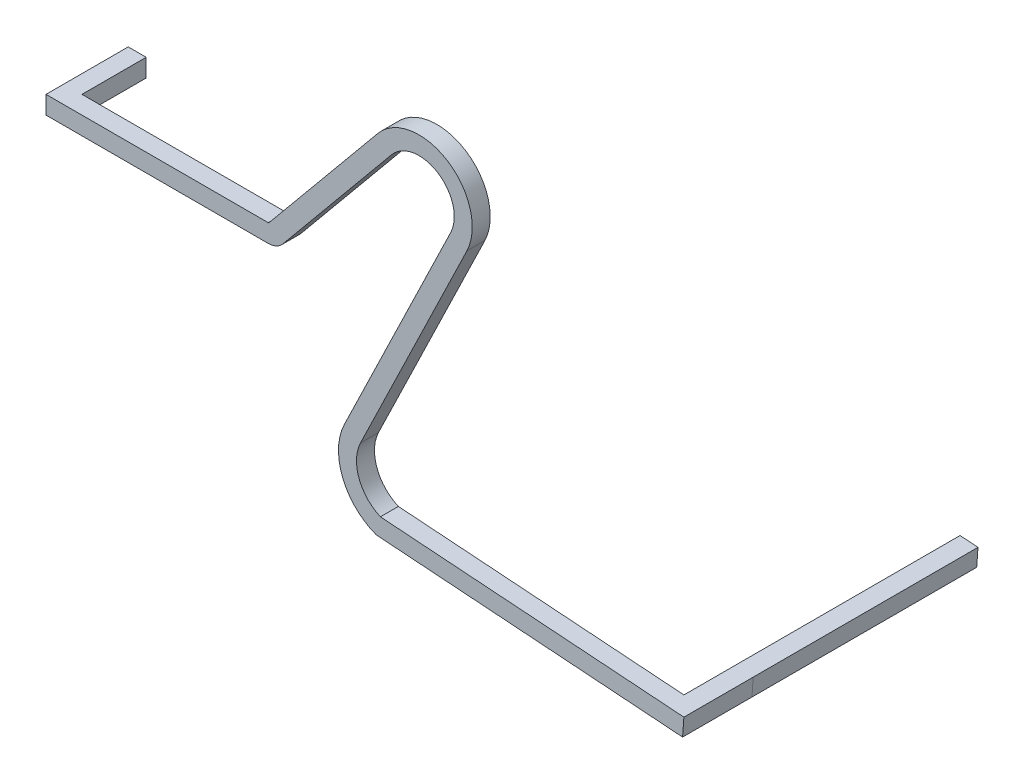
ISO-10303-21;
HEADER;
FILE_DESCRIPTION(('STEP AP214'),'2;1');
FILE_NAME('part.step','',(''),(''),'','','');
FILE_SCHEMA(('AUTOMOTIVE_DESIGN { 1 0 10303 214 1 1 1 1 }'));
ENDSEC;
DATA;
#1=APPLICATION_CONTEXT('core data for automotive mechanical design processes');
#2=APPLICATION_PROTOCOL_DEFINITION('international standard','automotive_design',2000,#1);
#3=PRODUCT_CONTEXT('',#1,'mechanical');
#4=PRODUCT('Part','Part','',(#3));
#5=PRODUCT_RELATED_PRODUCT_CATEGORY('part','',(#4));
#6=PRODUCT_DEFINITION_FORMATION('','',#4);
#7=PRODUCT_DEFINITION_CONTEXT('part definition',#1,'design');
#8=PRODUCT_DEFINITION('design','',#6,#7);
#9=PRODUCT_DEFINITION_SHAPE('','',#8);
#10=(LENGTH_UNIT() NAMED_UNIT(*) SI_UNIT(.MILLI.,.METRE.));
#11=(NAMED_UNIT(*) PLANE_ANGLE_UNIT() SI_UNIT($,.RADIAN.));
#12=(NAMED_UNIT(*) SI_UNIT($,.STERADIAN.) SOLID_ANGLE_UNIT());
#13=UNCERTAINTY_MEASURE_WITH_UNIT(LENGTH_MEASURE(1.E-05),#10,'distance_accuracy_value','');
#14=(GEOMETRIC_REPRESENTATION_CONTEXT(3) GLOBAL_UNCERTAINTY_ASSIGNED_CONTEXT((#13)) GLOBAL_UNIT_ASSIGNED_CONTEXT((#10,
#11,#12)) REPRESENTATION_CONTEXT('',''));
#15=CARTESIAN_POINT('',(0.,0.,0.));
#16=DIRECTION('',(0.,0.,1.));
#17=DIRECTION('',(1.,0.,0.));
#18=AXIS2_PLACEMENT_3D('',#15,#16,#17);
#19=CARTESIAN_POINT('',(34.5870726712376,3.,0.));
#20=DIRECTION('',(0.,0.,1.));
#21=DIRECTION('',(1.,0.,0.));
#22=AXIS2_PLACEMENT_3D('',#19,#20,#21);
#23=PLANE('',#22);
#24=DIRECTION('',(0.0715229264478328,0.997438956023043,0.));
#25=VECTOR('',#24,1.);
#26=CARTESIAN_POINT('',(96.5350253753501,-31.3225304509611,0.));
#27=LINE('',#26,#25);
#28=CARTESIAN_POINT('',(96.3347611812961,-34.1153595278256,0.));
#29=VERTEX_POINT('',#28);
#30=CARTESIAN_POINT('',(96.5350253753504,-31.3225304509611,0.));
#31=VERTEX_POINT('',#30);
#32=EDGE_CURVE('E222',#29,#31,#27,.T.);
#33=ORIENTED_EDGE('',*,*,#32,.F.);
#34=DIRECTION('',(0.997438956023042,-0.0715229264478418,0.));
#35=VECTOR('',#34,1.);
#36=CARTESIAN_POINT('',(51.4340056346123,-30.8956803514451,0.));
#37=LINE('',#36,#35);
#38=CARTESIAN_POINT('',(51.4340056346123,-30.8956803514452,0.));
#39=VERTEX_POINT('',#38);
#40=EDGE_CURVE('E425',#39,#29,#37,.T.);
#41=ORIENTED_EDGE('',*,*,#40,.F.);
#42=CARTESIAN_POINT('',(54.5578663478825,-22.4414513150105,0.));
#43=DIRECTION('',(0.,0.,1.));
#44=DIRECTION('',(1.,0.,0.));
#45=AXIS2_PLACEMENT_3D('',#42,#43,#44);
#46=CIRCLE('',#45,9.01290709795725);
#47=CARTESIAN_POINT('',(46.4475543876039,-18.5101240247217,0.));
#48=VERTEX_POINT('',#47);
#49=EDGE_CURVE('E423',#48,#39,#46,.T.);
#50=ORIENTED_EDGE('',*,*,#49,.F.);
#51=DIRECTION('',(-0.436188595706244,-0.899855271127427,0.));
#52=VECTOR('',#51,1.);
#53=CARTESIAN_POINT('',(63.0227210244412,15.6843762781205,0.));
#54=LINE('',#53,#52);
#55=CARTESIAN_POINT('',(63.0227210244412,15.6843762781205,0.));
#56=VERTEX_POINT('',#55);
#57=EDGE_CURVE('E421',#56,#48,#54,.T.);
#58=ORIENTED_EDGE('',*,*,#57,.F.);
#59=CARTESIAN_POINT('',(58.0735170332403,18.0834135545048,0.));
#60=DIRECTION('',(0.,0.,-1.));
#61=DIRECTION('',(1.,0.,0.));
#62=AXIS2_PLACEMENT_3D('',#59,#60,#61);
#63=CIRCLE('',#62,5.49999999999999);
#64=CARTESIAN_POINT('',(53.8333333333333,21.586389744981,0.));
#65=VERTEX_POINT('',#64);
#66=EDGE_CURVE('E419',#65,#56,#63,.T.);
#67=ORIENTED_EDGE('',*,*,#66,.F.);
#68=DIRECTION('',(0.636904761904762,0.770942490892179,0.));
#69=VECTOR('',#68,1.);
#70=CARTESIAN_POINT('',(36.8999001439141,1.08928571428572,0.));
#71=LINE('',#70,#69);
#72=CARTESIAN_POINT('',(36.8999001439141,1.08928571428571,0.));
#73=VERTEX_POINT('',#72);
#74=EDGE_CURVE('E417',#73,#65,#71,.T.);
#75=ORIENTED_EDGE('',*,*,#74,.F.);
#76=CARTESIAN_POINT('',(34.5870726712376,3.,0.));
#77=DIRECTION('',(0.,0.,1.));
#78=DIRECTION('',(1.,0.,0.));
#79=AXIS2_PLACEMENT_3D('',#76,#77,#78);
#80=CIRCLE('',#79,3.);
#81=CARTESIAN_POINT('',(34.5870726712376,0.,0.));
#82=VERTEX_POINT('',#81);
#83=EDGE_CURVE('E415',#82,#73,#80,.T.);
#84=ORIENTED_EDGE('',*,*,#83,.F.);
#85=DIRECTION('',(1.,0.,0.));
#86=VECTOR('',#85,1.);
#87=CARTESIAN_POINT('',(0.,0.,0.));
#88=LINE('',#87,#86);
#89=CARTESIAN_POINT('',(2.8,0.,0.));
#90=VERTEX_POINT('',#89);
#91=EDGE_CURVE('E238',#90,#82,#88,.T.);
#92=ORIENTED_EDGE('',*,*,#91,.F.);
#93=DIRECTION('',(0.,-1.,0.));
#94=VECTOR('',#93,1.);
#95=CARTESIAN_POINT('',(2.8,2.8,0.));
#96=LINE('',#95,#94);
#97=CARTESIAN_POINT('',(2.8,2.8,0.));
#98=VERTEX_POINT('',#97);
#99=EDGE_CURVE('E228',#98,#90,#96,.T.);
#100=ORIENTED_EDGE('',*,*,#99,.F.);
#101=DIRECTION('',(-1.,0.,0.));
#102=VECTOR('',#101,1.);
#103=CARTESIAN_POINT('',(0.,2.8,0.));
#104=LINE('',#103,#102);
#105=CARTESIAN_POINT('',(34.5870726712376,2.8,0.));
#106=VERTEX_POINT('',#105);
#107=EDGE_CURVE('E364',#106,#98,#104,.T.);
#108=ORIENTED_EDGE('',*,*,#107,.F.);
#109=CARTESIAN_POINT('',(34.5870726712376,3.,0.));
#110=DIRECTION('',(0.,0.,-1.));
#111=DIRECTION('',(1.,0.,0.));
#112=AXIS2_PLACEMENT_3D('',#109,#110,#111);
#113=CIRCLE('',#112,0.199999999999999);
#114=CARTESIAN_POINT('',(34.741261169416,2.87261904761905,0.));
#115=VERTEX_POINT('',#114);
#116=EDGE_CURVE('E362',#115,#106,#113,.T.);
#117=ORIENTED_EDGE('',*,*,#116,.F.);
#118=DIRECTION('',(-0.636904761904762,-0.77094249089218,0.));
#119=VECTOR('',#118,1.);
#120=CARTESIAN_POINT('',(34.741261169416,2.87261904761905,0.));
#121=LINE('',#120,#119);
#122=CARTESIAN_POINT('',(51.6746943588352,23.3697230783144,0.));
#123=VERTEX_POINT('',#122);
#124=EDGE_CURVE('E357',#123,#115,#121,.T.);
#125=ORIENTED_EDGE('',*,*,#124,.F.);
#126=CARTESIAN_POINT('',(58.0735170332403,18.0834135545048,0.));
#127=DIRECTION('',(0.,0.,1.));
#128=DIRECTION('',(1.,0.,0.));
#129=AXIS2_PLACEMENT_3D('',#126,#127,#128);
#130=CIRCLE('',#129,8.29999999999999);
#131=CARTESIAN_POINT('',(65.542315783598,14.463048210143,0.));
#132=VERTEX_POINT('',#131);
#133=EDGE_CURVE('E355',#132,#123,#130,.T.);
#134=ORIENTED_EDGE('',*,*,#133,.F.);
#135=DIRECTION('',(0.436188595706244,0.899855271127427,0.));
#136=VECTOR('',#135,1.);
#137=CARTESIAN_POINT('',(65.542315783598,14.463048210143,0.));
#138=LINE('',#137,#136);
#139=CARTESIAN_POINT('',(48.9671491467607,-19.7314520926992,0.));
#140=VERTEX_POINT('',#139);
#141=EDGE_CURVE('E345',#140,#132,#138,.T.);
#142=ORIENTED_EDGE('',*,*,#141,.F.);
#143=CARTESIAN_POINT('',(54.5578663478825,-22.4414513150105,0.));
#144=DIRECTION('',(0.,0.,-1.));
#145=DIRECTION('',(1.,0.,0.));
#146=AXIS2_PLACEMENT_3D('',#143,#144,#145);
#147=CIRCLE('',#146,6.21290709795726);
#148=CARTESIAN_POINT('',(52.0689106312986,-28.1340178757748,0.));
#149=VERTEX_POINT('',#148);
#150=EDGE_CURVE('E336',#149,#140,#147,.T.);
#151=ORIENTED_EDGE('',*,*,#150,.F.);
#152=DIRECTION('',(-0.997438956023042,0.0715229264478419,0.));
#153=VECTOR('',#152,1.);
#154=CARTESIAN_POINT('',(52.0689106312986,-28.1340178757748,0.));
#155=LINE('',#154,#153);
#156=EDGE_CURVE('E346',#31,#149,#155,.T.);
#157=ORIENTED_EDGE('',*,*,#156,.F.);
#158=EDGE_LOOP('',(#33,#41,#50,#58,#67,#75,#84,#92,#100,#108,#117,#125,#134,#142,#151,#157));
#159=FACE_BOUND('',#158,.T.);
#160=ADVANCED_FACE('F33',(#159),#23,.F.);
#161=CARTESIAN_POINT('',(0.,2.8,2.8));
#162=DIRECTION('',(1.,0.,0.));
#163=DIRECTION('',(0.,0.,-1.));
#164=AXIS2_PLACEMENT_3D('',#161,#162,#163);
#165=PLANE('',#164);
#166=DIRECTION('',(0.,0.,-1.));
#167=VECTOR('',#166,1.);
#168=CARTESIAN_POINT('',(0.,2.8,2.8));
#169=LINE('',#168,#167);
#170=CARTESIAN_POINT('',(0.,2.8,2.8));
#171=VERTEX_POINT('',#170);
#172=CARTESIAN_POINT('',(0.,2.8,-9.99999999999999));
#173=VERTEX_POINT('',#172);
#174=EDGE_CURVE('E367',#171,#173,#169,.T.);
#175=ORIENTED_EDGE('',*,*,#174,.T.);
#176=DIRECTION('',(0.,1.,0.));
#177=VECTOR('',#176,1.);
#178=CARTESIAN_POINT('',(0.,2.8,-9.99999999999999));
#179=LINE('',#178,#177);
#180=CARTESIAN_POINT('',(0.,0.,-9.99999999999999));
#181=VERTEX_POINT('',#180);
#182=EDGE_CURVE('E202',#181,#173,#179,.T.);
#183=ORIENTED_EDGE('',*,*,#182,.F.);
#184=DIRECTION('',(0.,0.,-1.));
#185=VECTOR('',#184,1.);
#186=CARTESIAN_POINT('',(0.,0.,2.8));
#187=LINE('',#186,#185);
#188=CARTESIAN_POINT('',(0.,0.,2.8));
#189=VERTEX_POINT('',#188);
#190=EDGE_CURVE('E11',#189,#181,#187,.T.);
#191=ORIENTED_EDGE('',*,*,#190,.F.);
#192=DIRECTION('',(0.,-1.,0.));
#193=VECTOR('',#192,1.);
#194=CARTESIAN_POINT('',(0.,2.8,2.8));
#195=LINE('',#194,#193);
#196=EDGE_CURVE('E231',#171,#189,#195,.T.);
#197=ORIENTED_EDGE('',*,*,#196,.F.);
#198=EDGE_LOOP('',(#175,#183,#191,#197));
#199=FACE_BOUND('',#198,.T.);
#200=ADVANCED_FACE('F35',(#199),#165,.F.);
#201=CARTESIAN_POINT('',(0.,0.,2.8));
#202=DIRECTION('',(0.,1.,0.));
#203=DIRECTION('',(0.,0.,1.));
#204=AXIS2_PLACEMENT_3D('',#201,#202,#203);
#205=PLANE('',#204);
#206=ORIENTED_EDGE('',*,*,#190,.T.);
#207=DIRECTION('',(1.,0.,0.));
#208=VECTOR('',#207,1.);
#209=CARTESIAN_POINT('',(0.,0.,-9.99999999999999));
#210=LINE('',#209,#208);
#211=CARTESIAN_POINT('',(2.8,0.,-9.99999999999999));
#212=VERTEX_POINT('',#211);
#213=EDGE_CURVE('E219',#181,#212,#210,.T.);
#214=ORIENTED_EDGE('',*,*,#213,.T.);
#215=DIRECTION('',(0.,0.,1.));
#216=VECTOR('',#215,1.);
#217=CARTESIAN_POINT('',(2.8,0.,-45.));
#218=LINE('',#217,#216);
#219=EDGE_CURVE('E237',#212,#90,#218,.T.);
#220=ORIENTED_EDGE('',*,*,#219,.T.);
#221=ORIENTED_EDGE('',*,*,#91,.T.);
#222=DIRECTION('',(0.,0.,-1.));
#223=VECTOR('',#222,1.);
#224=CARTESIAN_POINT('',(34.5870726712376,0.,2.8));
#225=LINE('',#224,#223);
#226=CARTESIAN_POINT('',(34.5870726712376,0.,2.8));
#227=VERTEX_POINT('',#226);
#228=EDGE_CURVE('E42',#227,#82,#225,.T.);
#229=ORIENTED_EDGE('',*,*,#228,.F.);
#230=DIRECTION('',(1.,0.,0.));
#231=VECTOR('',#230,1.);
#232=CARTESIAN_POINT('',(0.,0.,2.8));
#233=LINE('',#232,#231);
#234=EDGE_CURVE('E455',#189,#227,#233,.T.);
#235=ORIENTED_EDGE('',*,*,#234,.F.);
#236=EDGE_LOOP('',(#206,#214,#220,#221,#229,#235));
#237=FACE_BOUND('',#236,.T.);
#238=ADVANCED_FACE('F288',(#237),#205,.F.);
#239=CARTESIAN_POINT('',(34.5870726712376,3.,2.8));
#240=DIRECTION('',(0.,0.,-1.));
#241=DIRECTION('',(-1.,0.,0.));
#242=AXIS2_PLACEMENT_3D('',#239,#240,#241);
#243=CYLINDRICAL_SURFACE('',#242,3.);
#244=ORIENTED_EDGE('',*,*,#83,.T.);
#245=DIRECTION('',(0.,0.,-1.));
#246=VECTOR('',#245,1.);
#247=CARTESIAN_POINT('',(36.8999001439141,1.08928571428571,2.8));
#248=LINE('',#247,#246);
#249=CARTESIAN_POINT('',(36.8999001439141,1.08928571428571,2.8));
#250=VERTEX_POINT('',#249);
#251=EDGE_CURVE('E373',#250,#73,#248,.T.);
#252=ORIENTED_EDGE('',*,*,#251,.F.);
#253=CARTESIAN_POINT('',(34.5870726712376,3.,2.8));
#254=DIRECTION('',(0.,0.,1.));
#255=DIRECTION('',(1.,0.,0.));
#256=AXIS2_PLACEMENT_3D('',#253,#254,#255);
#257=CIRCLE('',#256,3.);
#258=EDGE_CURVE('E454',#227,#250,#257,.T.);
#259=ORIENTED_EDGE('',*,*,#258,.F.);
#260=ORIENTED_EDGE('',*,*,#228,.T.);
#261=EDGE_LOOP('',(#244,#252,#259,#260));
#262=FACE_BOUND('',#261,.T.);
#263=ADVANCED_FACE('F285',(#262),#243,.T.);
#264=CARTESIAN_POINT('',(36.8999001439141,1.08928571428572,2.8));
#265=DIRECTION('',(-0.770942490892179,0.636904761904762,0.));
#266=DIRECTION('',(-0.636904761904762,-0.770942490892179,0.));
#267=AXIS2_PLACEMENT_3D('',#264,#265,#266);
#268=PLANE('',#267);
#269=ORIENTED_EDGE('',*,*,#74,.T.);
#270=DIRECTION('',(0.,0.,-1.));
#271=VECTOR('',#270,1.);
#272=CARTESIAN_POINT('',(53.8333333333333,21.586389744981,2.8));
#273=LINE('',#272,#271);
#274=CARTESIAN_POINT('',(53.8333333333333,21.586389744981,2.8));
#275=VERTEX_POINT('',#274);
#276=EDGE_CURVE('E376',#275,#65,#273,.T.);
#277=ORIENTED_EDGE('',*,*,#276,.F.);
#278=DIRECTION('',(0.636904761904762,0.770942490892179,0.));
#279=VECTOR('',#278,1.);
#280=CARTESIAN_POINT('',(36.8999001439141,1.08928571428572,2.8));
#281=LINE('',#280,#279);
#282=EDGE_CURVE('E447',#250,#275,#281,.T.);
#283=ORIENTED_EDGE('',*,*,#282,.F.);
#284=ORIENTED_EDGE('',*,*,#251,.T.);
#285=EDGE_LOOP('',(#269,#277,#283,#284));
#286=FACE_BOUND('',#285,.T.);
#287=ADVANCED_FACE('F281',(#286),#268,.F.);
#288=CARTESIAN_POINT('',(58.0735170332403,18.0834135545048,2.8));
#289=DIRECTION('',(0.,0.,-1.));
#290=DIRECTION('',(-1.,0.,0.));
#291=AXIS2_PLACEMENT_3D('',#288,#289,#290);
#292=CYLINDRICAL_SURFACE('',#291,5.49999999999999);
#293=ORIENTED_EDGE('',*,*,#66,.T.);
#294=DIRECTION('',(0.,0.,-1.));
#295=VECTOR('',#294,1.);
#296=CARTESIAN_POINT('',(63.0227210244412,15.6843762781205,2.8));
#297=LINE('',#296,#295);
#298=CARTESIAN_POINT('',(63.0227210244412,15.6843762781205,2.8));
#299=VERTEX_POINT('',#298);
#300=EDGE_CURVE('E379',#299,#56,#297,.T.);
#301=ORIENTED_EDGE('',*,*,#300,.F.);
#302=CARTESIAN_POINT('',(58.0735170332403,18.0834135545048,2.8));
#303=DIRECTION('',(0.,0.,-1.));
#304=DIRECTION('',(1.,0.,0.));
#305=AXIS2_PLACEMENT_3D('',#302,#303,#304);
#306=CIRCLE('',#305,5.49999999999999);
#307=EDGE_CURVE('E444',#275,#299,#306,.T.);
#308=ORIENTED_EDGE('',*,*,#307,.F.);
#309=ORIENTED_EDGE('',*,*,#276,.T.);
#310=EDGE_LOOP('',(#293,#301,#308,#309));
#311=FACE_BOUND('',#310,.T.);
#312=ADVANCED_FACE('F277',(#311),#292,.F.);
#313=CARTESIAN_POINT('',(63.0227210244412,15.6843762781205,2.8));
#314=DIRECTION('',(0.899855271127427,-0.436188595706244,0.));
#315=DIRECTION('',(0.436188595706244,0.899855271127427,0.));
#316=AXIS2_PLACEMENT_3D('',#313,#314,#315);
#317=PLANE('',#316);
#318=ORIENTED_EDGE('',*,*,#57,.T.);
#319=DIRECTION('',(0.,0.,-1.));
#320=VECTOR('',#319,1.);
#321=CARTESIAN_POINT('',(46.4475543876039,-18.5101240247217,2.8));
#322=LINE('',#321,#320);
#323=CARTESIAN_POINT('',(46.4475543876039,-18.5101240247217,2.8));
#324=VERTEX_POINT('',#323);
#325=EDGE_CURVE('E382',#324,#48,#322,.T.);
#326=ORIENTED_EDGE('',*,*,#325,.F.);
#327=DIRECTION('',(-0.436188595706244,-0.899855271127427,0.));
#328=VECTOR('',#327,1.);
#329=CARTESIAN_POINT('',(63.0227210244412,15.6843762781205,2.8));
#330=LINE('',#329,#328);
#331=EDGE_CURVE('E442',#299,#324,#330,.T.);
#332=ORIENTED_EDGE('',*,*,#331,.F.);
#333=ORIENTED_EDGE('',*,*,#300,.T.);
#334=EDGE_LOOP('',(#318,#326,#332,#333));
#335=FACE_BOUND('',#334,.T.);
#336=ADVANCED_FACE('F273',(#335),#317,.F.);
#337=CARTESIAN_POINT('',(54.5578663478825,-22.4414513150105,2.8));
#338=DIRECTION('',(0.,0.,-1.));
#339=DIRECTION('',(-1.,0.,0.));
#340=AXIS2_PLACEMENT_3D('',#337,#338,#339);
#341=CYLINDRICAL_SURFACE('',#340,9.01290709795725);
#342=ORIENTED_EDGE('',*,*,#49,.T.);
#343=DIRECTION('',(0.,0.,-1.));
#344=VECTOR('',#343,1.);
#345=CARTESIAN_POINT('',(51.4340056346123,-30.8956803514452,2.8));
#346=LINE('',#345,#344);
#347=CARTESIAN_POINT('',(51.4340056346123,-30.8956803514452,2.8));
#348=VERTEX_POINT('',#347);
#349=EDGE_CURVE('E385',#348,#39,#346,.T.);
#350=ORIENTED_EDGE('',*,*,#349,.F.);
#351=CARTESIAN_POINT('',(54.5578663478825,-22.4414513150105,2.8));
#352=DIRECTION('',(0.,0.,1.));
#353=DIRECTION('',(1.,0.,0.));
#354=AXIS2_PLACEMENT_3D('',#351,#352,#353);
#355=CIRCLE('',#354,9.01290709795725);
#356=EDGE_CURVE('E435',#324,#348,#355,.T.);
#357=ORIENTED_EDGE('',*,*,#356,.F.);
#358=ORIENTED_EDGE('',*,*,#325,.T.);
#359=EDGE_LOOP('',(#342,#350,#357,#358));
#360=FACE_BOUND('',#359,.T.);
#361=ADVANCED_FACE('F269',(#360),#341,.T.);
#362=CARTESIAN_POINT('',(51.4340056346123,-30.8956803514451,2.8));
#363=DIRECTION('',(0.0715229264478418,0.997438956023043,0.));
#364=DIRECTION('',(-0.997438956023042,0.0715229264478418,0.));
#365=AXIS2_PLACEMENT_3D('',#362,#363,#364);
#366=PLANE('',#365);
#367=ORIENTED_EDGE('',*,*,#40,.T.);
#368=DIRECTION('',(0.,0.,1.));
#369=VECTOR('',#368,1.);
#370=CARTESIAN_POINT('',(96.3347611812961,-34.1153595278256,-8.));
#371=LINE('',#370,#369);
#372=CARTESIAN_POINT('',(96.3347611812961,-34.1153595278256,-43.));
#373=VERTEX_POINT('',#372);
#374=EDGE_CURVE('E226',#373,#29,#371,.T.);
#375=ORIENTED_EDGE('',*,*,#374,.F.);
#376=DIRECTION('',(-0.997438956023043,0.0715229264478334,0.));
#377=VECTOR('',#376,1.);
#378=CARTESIAN_POINT('',(96.3347611812961,-34.1153595278256,-43.));
#379=LINE('',#378,#377);
#380=CARTESIAN_POINT('',(99.1272845232605,-34.3156017986785,-43.));
#381=VERTEX_POINT('',#380);
#382=EDGE_CURVE('E189',#381,#373,#379,.T.);
#383=ORIENTED_EDGE('',*,*,#382,.F.);
#384=DIRECTION('',(0.,0.,1.));
#385=VECTOR('',#384,1.);
#386=CARTESIAN_POINT('',(99.1272845232605,-34.3156017986785,-43.));
#387=LINE('',#386,#385);
#388=CARTESIAN_POINT('',(99.1274373907106,-34.315612760279,-8.));
#389=VERTEX_POINT('',#388);
#390=EDGE_CURVE('E185',#381,#389,#387,.T.);
#391=ORIENTED_EDGE('',*,*,#390,.T.);
#392=DIRECTION('',(0.,0.,-1.));
#393=VECTOR('',#392,1.);
#394=CARTESIAN_POINT('',(99.1275902581607,-34.3156237218795,2.8));
#395=LINE('',#394,#393);
#396=CARTESIAN_POINT('',(99.1275902581607,-34.3156237218795,2.8));
#397=VERTEX_POINT('',#396);
#398=EDGE_CURVE('E388',#397,#389,#395,.T.);
#399=ORIENTED_EDGE('',*,*,#398,.F.);
#400=DIRECTION('',(0.997438956023042,-0.0715229264478418,0.));
#401=VECTOR('',#400,1.);
#402=CARTESIAN_POINT('',(51.4340056346123,-30.8956803514451,2.8));
#403=LINE('',#402,#401);
#404=EDGE_CURVE('E433',#348,#397,#403,.T.);
#405=ORIENTED_EDGE('',*,*,#404,.F.);
#406=ORIENTED_EDGE('',*,*,#349,.T.);
#407=EDGE_LOOP('',(#367,#375,#383,#391,#399,#405,#406));
#408=FACE_BOUND('',#407,.T.);
#409=ADVANCED_FACE('F265',(#408),#366,.F.);
#410=CARTESIAN_POINT('',(99.3278544522146,-31.522794645015,2.8));
#411=DIRECTION('',(-0.997438956023043,0.0715229264478328,0.));
#412=DIRECTION('',(-0.0715229264478328,-0.997438956023043,0.));
#413=AXIS2_PLACEMENT_3D('',#410,#411,#412);
#414=PLANE('',#413);
#415=ORIENTED_EDGE('',*,*,#398,.T.);
#416=CARTESIAN_POINT('',(99.3275487173145,-31.5227727218139,-7.99999999999999));
#417=DIRECTION('',(-0.0715229264478328,-0.997438956023043,0.));
#418=VECTOR('',#417,1.);
#419=LINE('',#416,#418);
#420=CARTESIAN_POINT('',(99.3277015847645,-31.5227836834145,-8.));
#421=VERTEX_POINT('',#420);
#422=EDGE_CURVE('E224',#421,#389,#419,.T.);
#423=ORIENTED_EDGE('',*,*,#422,.F.);
#424=DIRECTION('',(0.,0.,-1.));
#425=VECTOR('',#424,1.);
#426=CARTESIAN_POINT('',(99.3278544522146,-31.522794645015,2.8));
#427=LINE('',#426,#425);
#428=CARTESIAN_POINT('',(99.3278544522146,-31.522794645015,2.8));
#429=VERTEX_POINT('',#428);
#430=EDGE_CURVE('E200',#429,#421,#427,.T.);
#431=ORIENTED_EDGE('',*,*,#430,.F.);
#432=DIRECTION('',(0.0715229264478328,0.997438956023043,0.));
#433=VECTOR('',#432,1.);
#434=CARTESIAN_POINT('',(99.3278544522146,-31.522794645015,2.8));
#435=LINE('',#434,#433);
#436=EDGE_CURVE('E469',#397,#429,#435,.T.);
#437=ORIENTED_EDGE('',*,*,#436,.F.);
#438=EDGE_LOOP('',(#415,#423,#431,#437));
#439=FACE_BOUND('',#438,.T.);
#440=ADVANCED_FACE('F255',(#439),#414,.F.);
#441=CARTESIAN_POINT('',(52.0689106312986,-28.1340178757748,2.8));
#442=DIRECTION('',(-0.0715229264478419,-0.997438956023043,0.));
#443=DIRECTION('',(0.997438956023042,-0.0715229264478419,0.));
#444=AXIS2_PLACEMENT_3D('',#441,#442,#443);
#445=PLANE('',#444);
#446=ORIENTED_EDGE('',*,*,#430,.T.);
#447=DIRECTION('',(0.,0.,1.));
#448=VECTOR('',#447,1.);
#449=CARTESIAN_POINT('',(99.3275487173145,-31.5227727218139,-43.));
#450=LINE('',#449,#448);
#451=CARTESIAN_POINT('',(99.3275487173145,-31.5227727218139,-43.));
#452=VERTEX_POINT('',#451);
#453=EDGE_CURVE('E183',#452,#421,#450,.T.);
#454=ORIENTED_EDGE('',*,*,#453,.F.);
#455=DIRECTION('',(0.997438956023043,-0.0715229264478334,0.));
#456=VECTOR('',#455,1.);
#457=CARTESIAN_POINT('',(96.5350253753501,-31.3225304509611,-43.));
#458=LINE('',#457,#456);
#459=CARTESIAN_POINT('',(96.5350253753501,-31.3225304509611,-43.));
#460=VERTEX_POINT('',#459);
#461=EDGE_CURVE('E190',#460,#452,#458,.T.);
#462=ORIENTED_EDGE('',*,*,#461,.F.);
#463=DIRECTION('',(0.,0.,1.));
#464=VECTOR('',#463,1.);
#465=CARTESIAN_POINT('',(96.5350253753501,-31.3225304509611,-8.));
#466=LINE('',#465,#464);
#467=EDGE_CURVE('E58',#460,#31,#466,.T.);
#468=ORIENTED_EDGE('',*,*,#467,.T.);
#469=ORIENTED_EDGE('',*,*,#156,.T.);
#470=DIRECTION('',(0.,0.,-1.));
#471=VECTOR('',#470,1.);
#472=CARTESIAN_POINT('',(52.0689106312986,-28.1340178757748,2.8));
#473=LINE('',#472,#471);
#474=CARTESIAN_POINT('',(52.0689106312986,-28.1340178757748,2.8));
#475=VERTEX_POINT('',#474);
#476=EDGE_CURVE('E342',#475,#149,#473,.T.);
#477=ORIENTED_EDGE('',*,*,#476,.F.);
#478=DIRECTION('',(-0.997438956023042,0.0715229264478419,0.));
#479=VECTOR('',#478,1.);
#480=CARTESIAN_POINT('',(52.0689106312986,-28.1340178757748,2.8));
#481=LINE('',#480,#479);
#482=EDGE_CURVE('E471',#429,#475,#481,.T.);
#483=ORIENTED_EDGE('',*,*,#482,.F.);
#484=EDGE_LOOP('',(#446,#454,#462,#468,#469,#477,#483));
#485=FACE_BOUND('',#484,.T.);
#486=ADVANCED_FACE('F197',(#485),#445,.F.);
#487=CARTESIAN_POINT('',(54.5578663478825,-22.4414513150105,2.8));
#488=DIRECTION('',(0.,0.,-1.));
#489=DIRECTION('',(-1.,0.,0.));
#490=AXIS2_PLACEMENT_3D('',#487,#488,#489);
#491=CYLINDRICAL_SURFACE('',#490,6.21290709795726);
#492=ORIENTED_EDGE('',*,*,#150,.T.);
#493=DIRECTION('',(0.,0.,-1.));
#494=VECTOR('',#493,1.);
#495=CARTESIAN_POINT('',(48.9671491467607,-19.7314520926992,2.8));
#496=LINE('',#495,#494);
#497=CARTESIAN_POINT('',(48.9671491467607,-19.7314520926992,2.8));
#498=VERTEX_POINT('',#497);
#499=EDGE_CURVE('E339',#498,#140,#496,.T.);
#500=ORIENTED_EDGE('',*,*,#499,.F.);
#501=CARTESIAN_POINT('',(54.5578663478825,-22.4414513150105,2.8));
#502=DIRECTION('',(0.,0.,-1.));
#503=DIRECTION('',(1.,0.,0.));
#504=AXIS2_PLACEMENT_3D('',#501,#502,#503);
#505=CIRCLE('',#504,6.21290709795726);
#506=EDGE_CURVE('E473',#475,#498,#505,.T.);
#507=ORIENTED_EDGE('',*,*,#506,.F.);
#508=ORIENTED_EDGE('',*,*,#476,.T.);
#509=EDGE_LOOP('',(#492,#500,#507,#508));
#510=FACE_BOUND('',#509,.T.);
#511=ADVANCED_FACE('F325',(#510),#491,.F.);
#512=CARTESIAN_POINT('',(65.542315783598,14.463048210143,2.8));
#513=DIRECTION('',(-0.899855271127427,0.436188595706244,0.));
#514=DIRECTION('',(-0.436188595706244,-0.899855271127427,0.));
#515=AXIS2_PLACEMENT_3D('',#512,#513,#514);
#516=PLANE('',#515);
#517=ORIENTED_EDGE('',*,*,#141,.T.);
#518=DIRECTION('',(0.,0.,-1.));
#519=VECTOR('',#518,1.);
#520=CARTESIAN_POINT('',(65.542315783598,14.463048210143,2.8));
#521=LINE('',#520,#519);
#522=CARTESIAN_POINT('',(65.542315783598,14.463048210143,2.8));
#523=VERTEX_POINT('',#522);
#524=EDGE_CURVE('E351',#523,#132,#521,.T.);
#525=ORIENTED_EDGE('',*,*,#524,.F.);
#526=DIRECTION('',(0.436188595706244,0.899855271127427,0.));
#527=VECTOR('',#526,1.);
#528=CARTESIAN_POINT('',(65.542315783598,14.463048210143,2.8));
#529=LINE('',#528,#527);
#530=EDGE_CURVE('E350',#498,#523,#529,.T.);
#531=ORIENTED_EDGE('',*,*,#530,.F.);
#532=ORIENTED_EDGE('',*,*,#499,.T.);
#533=EDGE_LOOP('',(#517,#525,#531,#532));
#534=FACE_BOUND('',#533,.T.);
#535=ADVANCED_FACE('F322',(#534),#516,.F.);
#536=CARTESIAN_POINT('',(58.0735170332403,18.0834135545048,2.8));
#537=DIRECTION('',(0.,0.,-1.));
#538=DIRECTION('',(-1.,0.,0.));
#539=AXIS2_PLACEMENT_3D('',#536,#537,#538);
#540=CYLINDRICAL_SURFACE('',#539,8.29999999999999);
#541=ORIENTED_EDGE('',*,*,#133,.T.);
#542=DIRECTION('',(0.,0.,-1.));
#543=VECTOR('',#542,1.);
#544=CARTESIAN_POINT('',(51.6746943588352,23.3697230783144,2.8));
#545=LINE('',#544,#543);
#546=CARTESIAN_POINT('',(51.6746943588352,23.3697230783144,2.8));
#547=VERTEX_POINT('',#546);
#548=EDGE_CURVE('E391',#547,#123,#545,.T.);
#549=ORIENTED_EDGE('',*,*,#548,.F.);
#550=CARTESIAN_POINT('',(58.0735170332403,18.0834135545048,2.8));
#551=DIRECTION('',(0.,0.,1.));
#552=DIRECTION('',(1.,0.,0.));
#553=AXIS2_PLACEMENT_3D('',#550,#551,#552);
#554=CIRCLE('',#553,8.29999999999999);
#555=EDGE_CURVE('E476',#523,#547,#554,.T.);
#556=ORIENTED_EDGE('',*,*,#555,.F.);
#557=ORIENTED_EDGE('',*,*,#524,.T.);
#558=EDGE_LOOP('',(#541,#549,#556,#557));
#559=FACE_BOUND('',#558,.T.);
#560=ADVANCED_FACE('F318',(#559),#540,.T.);
#561=CARTESIAN_POINT('',(34.741261169416,2.87261904761905,2.8));
#562=DIRECTION('',(0.77094249089218,-0.636904761904762,0.));
#563=DIRECTION('',(0.636904761904762,0.770942490892179,0.));
#564=AXIS2_PLACEMENT_3D('',#561,#562,#563);
#565=PLANE('',#564);
#566=ORIENTED_EDGE('',*,*,#124,.T.);
#567=DIRECTION('',(0.,0.,-1.));
#568=VECTOR('',#567,1.);
#569=CARTESIAN_POINT('',(34.741261169416,2.87261904761905,2.8));
#570=LINE('',#569,#568);
#571=CARTESIAN_POINT('',(34.741261169416,2.87261904761905,2.8));
#572=VERTEX_POINT('',#571);
#573=EDGE_CURVE('E394',#572,#115,#570,.T.);
#574=ORIENTED_EDGE('',*,*,#573,.F.);
#575=DIRECTION('',(-0.636904761904762,-0.77094249089218,0.));
#576=VECTOR('',#575,1.);
#577=CARTESIAN_POINT('',(34.741261169416,2.87261904761905,2.8));
#578=LINE('',#577,#576);
#579=EDGE_CURVE('E410',#547,#572,#578,.T.);
#580=ORIENTED_EDGE('',*,*,#579,.F.);
#581=ORIENTED_EDGE('',*,*,#548,.T.);
#582=EDGE_LOOP('',(#566,#574,#580,#581));
#583=FACE_BOUND('',#582,.T.);
#584=ADVANCED_FACE('F314',(#583),#565,.F.);
#585=CARTESIAN_POINT('',(34.5870726712376,3.,2.8));
#586=DIRECTION('',(0.,0.,-1.));
#587=DIRECTION('',(-1.,0.,0.));
#588=AXIS2_PLACEMENT_3D('',#585,#586,#587);
#589=CYLINDRICAL_SURFACE('',#588,0.199999999999999);
#590=ORIENTED_EDGE('',*,*,#116,.T.);
#591=DIRECTION('',(0.,0.,-1.));
#592=VECTOR('',#591,1.);
#593=CARTESIAN_POINT('',(34.5870726712376,2.8,2.8));
#594=LINE('',#593,#592);
#595=CARTESIAN_POINT('',(34.5870726712376,2.8,2.8));
#596=VERTEX_POINT('',#595);
#597=EDGE_CURVE('E396',#596,#106,#594,.T.);
#598=ORIENTED_EDGE('',*,*,#597,.F.);
#599=CARTESIAN_POINT('',(34.5870726712376,3.,2.8));
#600=DIRECTION('',(0.,0.,-1.));
#601=DIRECTION('',(1.,0.,0.));
#602=AXIS2_PLACEMENT_3D('',#599,#600,#601);
#603=CIRCLE('',#602,0.199999999999999);
#604=EDGE_CURVE('E406',#572,#596,#603,.T.);
#605=ORIENTED_EDGE('',*,*,#604,.F.);
#606=ORIENTED_EDGE('',*,*,#573,.T.);
#607=EDGE_LOOP('',(#590,#598,#605,#606));
#608=FACE_BOUND('',#607,.T.);
#609=ADVANCED_FACE('F310',(#608),#589,.F.);
#610=CARTESIAN_POINT('',(0.,2.8,2.8));
#611=DIRECTION('',(0.,-1.,0.));
#612=DIRECTION('',(0.,0.,-1.));
#613=AXIS2_PLACEMENT_3D('',#610,#611,#612);
#614=PLANE('',#613);
#615=DIRECTION('',(0.,0.,1.));
#616=VECTOR('',#615,1.);
#617=CARTESIAN_POINT('',(2.8,2.8,-45.));
#618=LINE('',#617,#616);
#619=CARTESIAN_POINT('',(2.8,2.8,-10.));
#620=VERTEX_POINT('',#619);
#621=EDGE_CURVE('E246',#620,#98,#618,.T.);
#622=ORIENTED_EDGE('',*,*,#621,.F.);
#623=DIRECTION('',(1.,0.,0.));
#624=VECTOR('',#623,1.);
#625=CARTESIAN_POINT('',(0.,2.8,-9.99999999999999));
#626=LINE('',#625,#624);
#627=EDGE_CURVE('E50',#173,#620,#626,.T.);
#628=ORIENTED_EDGE('',*,*,#627,.F.);
#629=ORIENTED_EDGE('',*,*,#174,.F.);
#630=DIRECTION('',(-1.,0.,0.));
#631=VECTOR('',#630,1.);
#632=CARTESIAN_POINT('',(0.,2.8,2.8));
#633=LINE('',#632,#631);
#634=EDGE_CURVE('E402',#596,#171,#633,.T.);
#635=ORIENTED_EDGE('',*,*,#634,.F.);
#636=ORIENTED_EDGE('',*,*,#597,.T.);
#637=ORIENTED_EDGE('',*,*,#107,.T.);
#638=EDGE_LOOP('',(#622,#628,#629,#635,#636,#637));
#639=FACE_BOUND('',#638,.T.);
#640=ADVANCED_FACE('F308',(#639),#614,.F.);
#641=CARTESIAN_POINT('',(34.5870726712376,3.,2.8));
#642=DIRECTION('',(0.,0.,1.));
#643=DIRECTION('',(1.,0.,0.));
#644=AXIS2_PLACEMENT_3D('',#641,#642,#643);
#645=PLANE('',#644);
#646=ORIENTED_EDGE('',*,*,#196,.T.);
#647=ORIENTED_EDGE('',*,*,#234,.T.);
#648=ORIENTED_EDGE('',*,*,#258,.T.);
#649=ORIENTED_EDGE('',*,*,#282,.T.);
#650=ORIENTED_EDGE('',*,*,#307,.T.);
#651=ORIENTED_EDGE('',*,*,#331,.T.);
#652=ORIENTED_EDGE('',*,*,#356,.T.);
#653=ORIENTED_EDGE('',*,*,#404,.T.);
#654=ORIENTED_EDGE('',*,*,#436,.T.);
#655=ORIENTED_EDGE('',*,*,#482,.T.);
#656=ORIENTED_EDGE('',*,*,#506,.T.);
#657=ORIENTED_EDGE('',*,*,#530,.T.);
#658=ORIENTED_EDGE('',*,*,#555,.T.);
#659=ORIENTED_EDGE('',*,*,#579,.T.);
#660=ORIENTED_EDGE('',*,*,#604,.T.);
#661=ORIENTED_EDGE('',*,*,#634,.T.);
#662=EDGE_LOOP('',(#646,#647,#648,#649,#650,#651,#652,#653,#654,#655,#656,#657,#658,#659,#660,#661));
#663=FACE_BOUND('',#662,.T.);
#664=ADVANCED_FACE('F306',(#663),#645,.T.);
#665=CARTESIAN_POINT('',(2.8,2.8,-45.));
#666=DIRECTION('',(-1.,0.,0.));
#667=DIRECTION('',(0.,-1.,0.));
#668=AXIS2_PLACEMENT_3D('',#665,#666,#667);
#669=PLANE('',#668);
#670=ORIENTED_EDGE('',*,*,#219,.F.);
#671=DIRECTION('',(0.,-1.,0.));
#672=VECTOR('',#671,1.);
#673=CARTESIAN_POINT('',(2.8,2.8,-9.99999999999999));
#674=LINE('',#673,#672);
#675=EDGE_CURVE('E217',#620,#212,#674,.T.);
#676=ORIENTED_EDGE('',*,*,#675,.F.);
#677=ORIENTED_EDGE('',*,*,#621,.T.);
#678=ORIENTED_EDGE('',*,*,#99,.T.);
#679=EDGE_LOOP('',(#670,#676,#677,#678));
#680=FACE_BOUND('',#679,.T.);
#681=ADVANCED_FACE('F458',(#680),#669,.F.);
#682=CARTESIAN_POINT('',(96.5350253753501,-31.3225304509611,-8.));
#683=DIRECTION('',(0.997438956023043,-0.0715229264478328,0.));
#684=DIRECTION('',(0.0715229264478328,0.997438956023043,0.));
#685=AXIS2_PLACEMENT_3D('',#682,#683,#684);
#686=PLANE('',#685);
#687=ORIENTED_EDGE('',*,*,#32,.T.);
#688=ORIENTED_EDGE('',*,*,#467,.F.);
#689=DIRECTION('',(0.0715229264478328,0.997438956023043,0.));
#690=VECTOR('',#689,1.);
#691=CARTESIAN_POINT('',(96.5350253753501,-31.3225304509611,-43.));
#692=LINE('',#691,#690);
#693=EDGE_CURVE('E195',#373,#460,#692,.T.);
#694=ORIENTED_EDGE('',*,*,#693,.F.);
#695=ORIENTED_EDGE('',*,*,#374,.T.);
#696=EDGE_LOOP('',(#687,#688,#694,#695));
#697=FACE_BOUND('',#696,.T.);
#698=ADVANCED_FACE('F486',(#697),#686,.F.);
#699=CARTESIAN_POINT('',(0.,0.,-9.99999999999999));
#700=DIRECTION('',(0.,0.,1.));
#701=DIRECTION('',(1.,0.,0.));
#702=AXIS2_PLACEMENT_3D('',#699,#700,#701);
#703=PLANE('',#702);
#704=ORIENTED_EDGE('',*,*,#182,.T.);
#705=ORIENTED_EDGE('',*,*,#627,.T.);
#706=ORIENTED_EDGE('',*,*,#675,.T.);
#707=ORIENTED_EDGE('',*,*,#213,.F.);
#708=EDGE_LOOP('',(#704,#705,#706,#707));
#709=FACE_BOUND('',#708,.T.);
#710=ADVANCED_FACE('F488',(#709),#703,.F.);
#711=CARTESIAN_POINT('',(99.3275487173145,-31.5227727218139,-43.));
#712=DIRECTION('',(-0.997438956023043,0.0715229264478328,0.));
#713=DIRECTION('',(-0.0715229264478328,-0.997438956023043,0.));
#714=AXIS2_PLACEMENT_3D('',#711,#712,#713);
#715=PLANE('',#714);
#716=ORIENTED_EDGE('',*,*,#422,.T.);
#717=ORIENTED_EDGE('',*,*,#390,.F.);
#718=DIRECTION('',(-0.0715229264478328,-0.997438956023043,0.));
#719=VECTOR('',#718,1.);
#720=CARTESIAN_POINT('',(99.3275487173145,-31.5227727218139,-43.));
#721=LINE('',#720,#719);
#722=EDGE_CURVE('E178',#452,#381,#721,.T.);
#723=ORIENTED_EDGE('',*,*,#722,.F.);
#724=ORIENTED_EDGE('',*,*,#453,.T.);
#725=EDGE_LOOP('',(#716,#717,#723,#724));
#726=FACE_BOUND('',#725,.T.);
#727=ADVANCED_FACE('F181',(#726),#715,.F.);
#728=CARTESIAN_POINT('',(0.,0.,-43.));
#729=DIRECTION('',(0.,0.,-1.));
#730=DIRECTION('',(-1.,0.,0.));
#731=AXIS2_PLACEMENT_3D('',#728,#729,#730);
#732=PLANE('',#731);
#733=ORIENTED_EDGE('',*,*,#461,.T.);
#734=ORIENTED_EDGE('',*,*,#722,.T.);
#735=ORIENTED_EDGE('',*,*,#382,.T.);
#736=ORIENTED_EDGE('',*,*,#693,.T.);
#737=EDGE_LOOP('',(#733,#734,#735,#736));
#738=FACE_BOUND('',#737,.T.);
#739=ADVANCED_FACE('F193',(#738),#732,.T.);
#740=CLOSED_SHELL('',(#160,#200,#238,#263,#287,#312,#336,#361,#409,#440,#486,#511,#535,#560,
#584,#609,#640,#664,#681,#698,#710,#727,#739));
#741=MANIFOLD_SOLID_BREP('B2',#740);
#742=ADVANCED_BREP_SHAPE_REPRESENTATION('',(#18,#741),#14);
#743=SHAPE_DEFINITION_REPRESENTATION(#9,#742);
ENDSEC;
END-ISO-10303-21;
